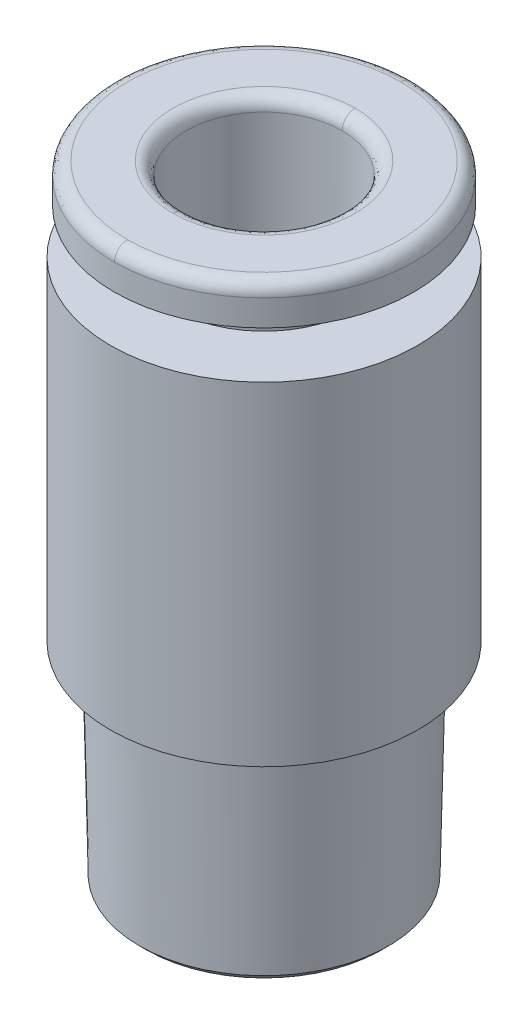
ISO-10303-21;
HEADER;
FILE_DESCRIPTION(('STEP AP214'),'2;1');
FILE_NAME('part.step','',(''),(''),'','','');
FILE_SCHEMA(('AUTOMOTIVE_DESIGN { 1 0 10303 214 1 1 1 1 }'));
ENDSEC;
DATA;
#1=APPLICATION_CONTEXT('core data for automotive mechanical design processes');
#2=APPLICATION_PROTOCOL_DEFINITION('international standard','automotive_design',2000,#1);
#3=PRODUCT_CONTEXT('',#1,'mechanical');
#4=PRODUCT('Part','Part','',(#3));
#5=PRODUCT_RELATED_PRODUCT_CATEGORY('part','',(#4));
#6=PRODUCT_DEFINITION_FORMATION('','',#4);
#7=PRODUCT_DEFINITION_CONTEXT('part definition',#1,'design');
#8=PRODUCT_DEFINITION('design','',#6,#7);
#9=PRODUCT_DEFINITION_SHAPE('','',#8);
#10=(LENGTH_UNIT() NAMED_UNIT(*) SI_UNIT(.MILLI.,.METRE.));
#11=(NAMED_UNIT(*) PLANE_ANGLE_UNIT() SI_UNIT($,.RADIAN.));
#12=(NAMED_UNIT(*) SI_UNIT($,.STERADIAN.) SOLID_ANGLE_UNIT());
#13=UNCERTAINTY_MEASURE_WITH_UNIT(LENGTH_MEASURE(1.E-05),#10,'distance_accuracy_value','');
#14=(GEOMETRIC_REPRESENTATION_CONTEXT(3) GLOBAL_UNCERTAINTY_ASSIGNED_CONTEXT((#13)) GLOBAL_UNIT_ASSIGNED_CONTEXT((#10,
#11,#12)) REPRESENTATION_CONTEXT('',''));
#15=CARTESIAN_POINT('',(0.,0.,0.));
#16=DIRECTION('',(0.,0.,1.));
#17=DIRECTION('',(1.,0.,0.));
#18=AXIS2_PLACEMENT_3D('',#15,#16,#17);
#19=CARTESIAN_POINT('',(-5.819,-1.5,5.819));
#20=DIRECTION('',(0.,-1.,0.));
#21=DIRECTION('',(0.,0.,-1.));
#22=AXIS2_PLACEMENT_3D('',#19,#20,#21);
#23=PLANE('',#22);
#24=CARTESIAN_POINT('',(0.,-1.5,0.));
#25=DIRECTION('',(0.,1.,0.));
#26=DIRECTION('',(0.,0.,1.));
#27=AXIS2_PLACEMENT_3D('',#24,#25,#26);
#28=CIRCLE('',#27,3.5);
#29=CARTESIAN_POINT('',(0.,-1.5,3.5));
#30=VERTEX_POINT('',#29);
#31=EDGE_CURVE('E256',#30,#30,#28,.T.);
#32=ORIENTED_EDGE('',*,*,#31,.T.);
#33=EDGE_LOOP('',(#32));
#34=FACE_BOUND('',#33,.T.);
#35=CARTESIAN_POINT('',(0.,-1.5,0.));
#36=DIRECTION('',(0.,1.,0.));
#37=DIRECTION('',(0.,0.,1.));
#38=AXIS2_PLACEMENT_3D('',#35,#36,#37);
#39=CIRCLE('',#38,5.75);
#40=CARTESIAN_POINT('',(0.,-1.5,5.75));
#41=VERTEX_POINT('',#40);
#42=EDGE_CURVE('E19',#41,#41,#39,.F.);
#43=ORIENTED_EDGE('',*,*,#42,.T.);
#44=EDGE_LOOP('',(#43));
#45=FACE_BOUND('',#44,.T.);
#46=ADVANCED_FACE('F15',(#34,#45),#23,.T.);
#47=CARTESIAN_POINT('',(0.,-1.5,0.));
#48=DIRECTION('',(0.,1.,0.));
#49=DIRECTION('',(0.,0.,1.));
#50=AXIS2_PLACEMENT_3D('',#47,#48,#49);
#51=CYLINDRICAL_SURFACE('',#50,5.75);
#52=ORIENTED_EDGE('',*,*,#42,.F.);
#53=EDGE_LOOP('',(#52));
#54=FACE_BOUND('',#53,.T.);
#55=CARTESIAN_POINT('',(0.,-0.499999999442258,0.));
#56=DIRECTION('',(0.,1.,0.));
#57=DIRECTION('',(-1.,0.,0.));
#58=AXIS2_PLACEMENT_3D('',#55,#56,#57);
#59=CIRCLE('',#58,5.75000000026619);
#60=CARTESIAN_POINT('',(-2.58156681732607E-10,-0.499999999581694,5.75000000019965));
#61=VERTEX_POINT('',#60);
#62=CARTESIAN_POINT('',(-5.89672356981577E-10,-0.499999999442258,-5.75000000019965));
#63=VERTEX_POINT('',#62);
#64=EDGE_CURVE('E248',#61,#63,#59,.T.);
#65=ORIENTED_EDGE('',*,*,#64,.F.);
#66=CARTESIAN_POINT('',(0.,-0.499999999442258,0.));
#67=DIRECTION('',(0.,1.,0.));
#68=DIRECTION('',(-1.,0.,0.));
#69=AXIS2_PLACEMENT_3D('',#66,#67,#68);
#70=CIRCLE('',#69,5.75000000026619);
#71=EDGE_CURVE('E259',#63,#61,#70,.T.);
#72=ORIENTED_EDGE('',*,*,#71,.F.);
#73=EDGE_LOOP('',(#65,#72));
#74=FACE_BOUND('',#73,.T.);
#75=ADVANCED_FACE('F384',(#54,#74),#51,.T.);
#76=CARTESIAN_POINT('',(0.,-3.2,0.));
#77=DIRECTION('',(0.,1.,0.));
#78=DIRECTION('',(0.,0.,1.));
#79=AXIS2_PLACEMENT_3D('',#76,#77,#78);
#80=CYLINDRICAL_SURFACE('',#79,3.5);
#81=ORIENTED_EDGE('',*,*,#31,.F.);
#82=EDGE_LOOP('',(#81));
#83=FACE_BOUND('',#82,.T.);
#84=CARTESIAN_POINT('',(0.,-3.2,0.));
#85=DIRECTION('',(0.,1.,0.));
#86=DIRECTION('',(0.,0.,1.));
#87=AXIS2_PLACEMENT_3D('',#84,#85,#86);
#88=CIRCLE('',#87,3.5);
#89=CARTESIAN_POINT('',(0.,-3.2,3.5));
#90=VERTEX_POINT('',#89);
#91=EDGE_CURVE('E374',#90,#90,#88,.F.);
#92=ORIENTED_EDGE('',*,*,#91,.F.);
#93=EDGE_LOOP('',(#92));
#94=FACE_BOUND('',#93,.T.);
#95=ADVANCED_FACE('F233',(#83,#94),#80,.T.);
#96=CARTESIAN_POINT('',(0.,-0.002497917,5.200083292));
#97=CARTESIAN_POINT('',(10.400166583,-0.002497917,5.200083292));
#98=CARTESIAN_POINT('',(10.400166583,-0.002497917,-5.200083292));
#99=CARTESIAN_POINT('',(0.,-0.002497917,-5.200083292));
#100=CARTESIAN_POINT('',(0.,0.031610211,5.540026883));
#101=CARTESIAN_POINT('',(11.080053765,0.031610211,5.540026883));
#102=CARTESIAN_POINT('',(11.080053765,0.031610211,-5.540026883));
#103=CARTESIAN_POINT('',(0.,0.031610211,-5.540026883));
#104=CARTESIAN_POINT('',(0.,-0.209973117,5.781610211));
#105=CARTESIAN_POINT('',(11.563220423,-0.209973117,5.781610211));
#106=CARTESIAN_POINT('',(11.563220423,-0.209973117,-5.781610211));
#107=CARTESIAN_POINT('',(0.,-0.209973117,-5.781610211));
#108=CARTESIAN_POINT('',(0.,-0.549916708,5.747502083));
#109=CARTESIAN_POINT('',(11.495004165,-0.549916708,5.747502083));
#110=CARTESIAN_POINT('',(11.495004165,-0.549916708,-5.747502083));
#111=CARTESIAN_POINT('',(0.,-0.549916708,-5.747502083));
#112=(BOUNDED_SURFACE() B_SPLINE_SURFACE(3,3,((#96,#97,#98,#99),(#100,#101,#102,#103),(#104,
#105,#106,#107),(#108,#109,#110,#111)),.UNSPECIFIED.,.F.,.F.,
.F.) B_SPLINE_SURFACE_WITH_KNOTS((4,4),(4,4),(0.,1.),(0.,1.),
.UNSPECIFIED.) GEOMETRIC_REPRESENTATION_ITEM() RATIONAL_B_SPLINE_SURFACE(((1.,0.333333333333333,
0.333333333333333,1.),(0.755320871117972,0.251773623705991,0.251773623705991,0.755320871117972),
(0.755320871117972,0.251773623705991,0.251773623705991,0.755320871117972),(1.,0.333333333333333,
0.333333333333333,1.))) REPRESENTATION_ITEM('') SURFACE());
#113=CARTESIAN_POINT('',(0.,2.66194585747539E-10,-5.25000000080507));
#114=CARTESIAN_POINT('',(10.5000000006278,2.66194590023467E-10,-5.25000000080507));
#115=CARTESIAN_POINT('',(10.5000000006278,2.66194590023467E-10,5.25000000080507));
#116=CARTESIAN_POINT('',(0.,2.66194585747539E-10,5.25000000080507));
#117=(BOUNDED_CURVE() B_SPLINE_CURVE(3,(#113,#114,#115,#116),.UNSPECIFIED.,.F.,
.F.) B_SPLINE_CURVE_WITH_KNOTS((4,4),(0.,1.),
.UNSPECIFIED.) CURVE() GEOMETRIC_REPRESENTATION_ITEM() RATIONAL_B_SPLINE_CURVE((0.956578301969997,
0.318859433989999,0.318859433989999,0.956578301969997)) REPRESENTATION_ITEM(''));
#118=CARTESIAN_POINT('',(0.,1.59716751686634E-10,5.24999999939198));
#119=VERTEX_POINT('',#118);
#120=CARTESIAN_POINT('',(0.,1.59716751686634E-10,-5.24999999939198));
#121=VERTEX_POINT('',#120);
#122=EDGE_CURVE('E376',#119,#121,#117,.F.);
#123=CARTESIAN_POINT('',(0.,-0.002497917,5.200083292));
#124=CARTESIAN_POINT('',(0.,0.031610211,5.540026883));
#125=CARTESIAN_POINT('',(0.,-0.209973117,5.781610211));
#126=CARTESIAN_POINT('',(0.,-0.549916708,5.747502083));
#127=(BOUNDED_CURVE() B_SPLINE_CURVE(3,(#123,#124,#125,#126),.UNSPECIFIED.,.F.,
.F.) B_SPLINE_CURVE_WITH_KNOTS((4,4),(0.,1.),
.UNSPECIFIED.) CURVE() GEOMETRIC_REPRESENTATION_ITEM() RATIONAL_B_SPLINE_CURVE((1.,
0.755320871117972,0.755320871117972,1.)) REPRESENTATION_ITEM(''));
#128=EDGE_CURVE('E208',#61,#119,#127,.F.);
#129=CARTESIAN_POINT('',(0.,-0.002497917,-5.200083292));
#130=CARTESIAN_POINT('',(0.,0.031610211,-5.540026883));
#131=CARTESIAN_POINT('',(0.,-0.209973117,-5.781610211));
#132=CARTESIAN_POINT('',(0.,-0.549916708,-5.747502083));
#133=(BOUNDED_CURVE() B_SPLINE_CURVE(3,(#129,#130,#131,#132),.UNSPECIFIED.,.F.,
.F.) B_SPLINE_CURVE_WITH_KNOTS((4,4),(0.,1.),
.UNSPECIFIED.) CURVE() GEOMETRIC_REPRESENTATION_ITEM() RATIONAL_B_SPLINE_CURVE((1.,
0.755320871117972,0.755320871117972,1.)) REPRESENTATION_ITEM(''));
#134=EDGE_CURVE('E255',#121,#63,#133,.T.);
#135=ORIENTED_EDGE('',*,*,#122,.F.);
#136=ORIENTED_EDGE('',*,*,#128,.F.);
#137=ORIENTED_EDGE('',*,*,#64,.T.);
#138=ORIENTED_EDGE('',*,*,#134,.F.);
#139=EDGE_LOOP('',(#135,#136,#137,#138));
#140=FACE_BOUND('',#139,.T.);
#141=ADVANCED_FACE('F222',(#140),#112,.T.);
#142=CARTESIAN_POINT('',(0.,-0.002497917,-5.200083292));
#143=CARTESIAN_POINT('',(-10.400166583,-0.002497917,-5.200083292));
#144=CARTESIAN_POINT('',(-10.400166583,-0.002497917,5.200083292));
#145=CARTESIAN_POINT('',(0.,-0.002497917,5.200083292));
#146=CARTESIAN_POINT('',(0.,0.031610211,-5.540026883));
#147=CARTESIAN_POINT('',(-11.080053765,0.031610211,-5.540026883));
#148=CARTESIAN_POINT('',(-11.080053765,0.031610211,5.540026883));
#149=CARTESIAN_POINT('',(0.,0.031610211,5.540026883));
#150=CARTESIAN_POINT('',(0.,-0.209973117,-5.781610211));
#151=CARTESIAN_POINT('',(-11.563220423,-0.209973117,-5.781610211));
#152=CARTESIAN_POINT('',(-11.563220423,-0.209973117,5.781610211));
#153=CARTESIAN_POINT('',(0.,-0.209973117,5.781610211));
#154=CARTESIAN_POINT('',(0.,-0.549916708,-5.747502083));
#155=CARTESIAN_POINT('',(-11.495004165,-0.549916708,-5.747502083));
#156=CARTESIAN_POINT('',(-11.495004165,-0.549916708,5.747502083));
#157=CARTESIAN_POINT('',(0.,-0.549916708,5.747502083));
#158=(BOUNDED_SURFACE() B_SPLINE_SURFACE(3,3,((#142,#143,#144,#145),(#146,#147,#148,#149),(#150,
#151,#152,#153),(#154,#155,#156,#157)),.UNSPECIFIED.,.F.,.F.,
.F.) B_SPLINE_SURFACE_WITH_KNOTS((4,4),(4,4),(0.,1.),(0.,1.),
.UNSPECIFIED.) GEOMETRIC_REPRESENTATION_ITEM() RATIONAL_B_SPLINE_SURFACE(((1.,0.333333333333333,
0.333333333333333,1.),(0.755320871117972,0.251773623705991,0.251773623705991,0.755320871117972),
(0.755320871117972,0.251773623705991,0.251773623705991,0.755320871117972),(1.,0.333333333333333,
0.333333333333333,1.))) REPRESENTATION_ITEM('') SURFACE());
#159=CARTESIAN_POINT('',(0.,2.6619458558077E-10,5.25000000080507));
#160=CARTESIAN_POINT('',(-10.5000000006278,2.6619458974894E-10,5.25000000080507));
#161=CARTESIAN_POINT('',(-10.5000000006278,2.6619458974894E-10,-5.25000000080507));
#162=CARTESIAN_POINT('',(0.,2.6619458558077E-10,-5.25000000080507));
#163=(BOUNDED_CURVE() B_SPLINE_CURVE(3,(#159,#160,#161,#162),.UNSPECIFIED.,.F.,
.F.) B_SPLINE_CURVE_WITH_KNOTS((4,4),(0.,1.),
.UNSPECIFIED.) CURVE() GEOMETRIC_REPRESENTATION_ITEM() RATIONAL_B_SPLINE_CURVE((0.956578301969996,
0.318859433989999,0.318859433989999,0.956578301969996)) REPRESENTATION_ITEM(''));
#164=EDGE_CURVE('E204',#121,#119,#163,.F.);
#165=ORIENTED_EDGE('',*,*,#128,.T.);
#166=ORIENTED_EDGE('',*,*,#164,.F.);
#167=ORIENTED_EDGE('',*,*,#134,.T.);
#168=ORIENTED_EDGE('',*,*,#71,.T.);
#169=EDGE_LOOP('',(#165,#166,#167,#168));
#170=FACE_BOUND('',#169,.T.);
#171=ADVANCED_FACE('F210',(#170),#158,.T.);
#172=CARTESIAN_POINT('',(-5.9708,-3.2,-5.9708));
#173=DIRECTION('',(0.,1.,0.));
#174=DIRECTION('',(0.,0.,1.));
#175=AXIS2_PLACEMENT_3D('',#172,#173,#174);
#176=PLANE('',#175);
#177=ORIENTED_EDGE('',*,*,#91,.T.);
#178=EDGE_LOOP('',(#177));
#179=FACE_BOUND('',#178,.T.);
#180=CARTESIAN_POINT('',(0.,-3.2,0.));
#181=DIRECTION('',(0.,1.,0.));
#182=DIRECTION('',(0.,0.,1.));
#183=AXIS2_PLACEMENT_3D('',#180,#181,#182);
#184=CIRCLE('',#183,5.9);
#185=CARTESIAN_POINT('',(0.,-3.2,5.9));
#186=VERTEX_POINT('',#185);
#187=EDGE_CURVE('E371',#186,#186,#184,.T.);
#188=ORIENTED_EDGE('',*,*,#187,.T.);
#189=EDGE_LOOP('',(#188));
#190=FACE_BOUND('',#189,.T.);
#191=ADVANCED_FACE('F221',(#179,#190),#176,.T.);
#192=CARTESIAN_POINT('',(-5.313,0.,-5.313));
#193=DIRECTION('',(0.,1.,0.));
#194=DIRECTION('',(0.,0.,1.));
#195=AXIS2_PLACEMENT_3D('',#192,#193,#194);
#196=PLANE('',#195);
#197=CARTESIAN_POINT('',(0.,2.66194585363917E-10,-3.49999999919493));
#198=CARTESIAN_POINT('',(-6.99999999937216,2.66194589507712E-10,-3.49999999919493));
#199=CARTESIAN_POINT('',(-6.99999999937216,2.66194589507712E-10,3.49999999919493));
#200=CARTESIAN_POINT('',(0.,2.66194585363917E-10,3.49999999919493));
#201=(BOUNDED_CURVE() B_SPLINE_CURVE(3,(#197,#198,#199,#200),.UNSPECIFIED.,.F.,
.F.) B_SPLINE_CURVE_WITH_KNOTS((4,4),(0.,1.),
.UNSPECIFIED.) CURVE() GEOMETRIC_REPRESENTATION_ITEM() RATIONAL_B_SPLINE_CURVE((0.956578301969995,
0.318859433989998,0.318859433989998,0.956578301969995)) REPRESENTATION_ITEM(''));
#202=CARTESIAN_POINT('',(0.,1.59716751337877E-10,-3.49999999887202));
#203=VERTEX_POINT('',#202);
#204=CARTESIAN_POINT('',(0.,1.59716751337877E-10,3.49999999887202));
#205=VERTEX_POINT('',#204);
#206=EDGE_CURVE('E130',#203,#205,#201,.T.);
#207=ORIENTED_EDGE('',*,*,#206,.F.);
#208=CARTESIAN_POINT('',(0.,2.66194585682711E-10,3.49999999919493));
#209=CARTESIAN_POINT('',(6.99999999937216,2.66194590114184E-10,3.49999999919493));
#210=CARTESIAN_POINT('',(6.99999999937216,2.66194590114184E-10,-3.49999999919493));
#211=CARTESIAN_POINT('',(0.,2.66194585682711E-10,-3.49999999919493));
#212=(BOUNDED_CURVE() B_SPLINE_CURVE(3,(#208,#209,#210,#211),.UNSPECIFIED.,.F.,
.F.) B_SPLINE_CURVE_WITH_KNOTS((4,4),(0.,1.),
.UNSPECIFIED.) CURVE() GEOMETRIC_REPRESENTATION_ITEM() RATIONAL_B_SPLINE_CURVE((0.956578301969996,
0.318859433989998,0.318859433989998,0.956578301969996)) REPRESENTATION_ITEM(''));
#213=EDGE_CURVE('E148',#205,#203,#212,.T.);
#214=ORIENTED_EDGE('',*,*,#213,.F.);
#215=EDGE_LOOP('',(#207,#214));
#216=FACE_BOUND('',#215,.T.);
#217=ORIENTED_EDGE('',*,*,#122,.T.);
#218=ORIENTED_EDGE('',*,*,#164,.T.);
#219=EDGE_LOOP('',(#217,#218));
#220=FACE_BOUND('',#219,.T.);
#221=ADVANCED_FACE('F270',(#216,#220),#196,.T.);
#222=CARTESIAN_POINT('',(0.,-16.,0.));
#223=DIRECTION('',(0.,1.,0.));
#224=DIRECTION('',(0.,0.,1.));
#225=AXIS2_PLACEMENT_3D('',#222,#223,#224);
#226=CYLINDRICAL_SURFACE('',#225,5.9);
#227=CARTESIAN_POINT('',(0.,-16.,0.));
#228=DIRECTION('',(0.,1.,0.));
#229=DIRECTION('',(0.,0.,1.));
#230=AXIS2_PLACEMENT_3D('',#227,#228,#229);
#231=CIRCLE('',#230,5.9);
#232=CARTESIAN_POINT('',(0.,-16.,5.9));
#233=VERTEX_POINT('',#232);
#234=EDGE_CURVE('E124',#233,#233,#231,.T.);
#235=ORIENTED_EDGE('',*,*,#234,.T.);
#236=EDGE_LOOP('',(#235));
#237=FACE_BOUND('',#236,.T.);
#238=ORIENTED_EDGE('',*,*,#187,.F.);
#239=EDGE_LOOP('',(#238));
#240=FACE_BOUND('',#239,.T.);
#241=ADVANCED_FACE('F184',(#237,#240),#226,.T.);
#242=CARTESIAN_POINT('',(0.,-0.549916708,-3.002497917));
#243=CARTESIAN_POINT('',(-6.004995835,-0.549916708,-3.002497917));
#244=CARTESIAN_POINT('',(-6.004995835,-0.549916708,3.002497917));
#245=CARTESIAN_POINT('',(0.,-0.549916708,3.002497917));
#246=CARTESIAN_POINT('',(0.,-0.209973117,-2.968389789));
#247=CARTESIAN_POINT('',(-5.936779577,-0.209973117,-2.968389789));
#248=CARTESIAN_POINT('',(-5.936779577,-0.209973117,2.968389789));
#249=CARTESIAN_POINT('',(0.,-0.209973117,2.968389789));
#250=CARTESIAN_POINT('',(0.,0.031610211,-3.209973117));
#251=CARTESIAN_POINT('',(-6.419946235,0.031610211,-3.209973117));
#252=CARTESIAN_POINT('',(-6.419946235,0.031610211,3.209973117));
#253=CARTESIAN_POINT('',(0.,0.031610211,3.209973117));
#254=CARTESIAN_POINT('',(0.,-0.002497917,-3.549916708));
#255=CARTESIAN_POINT('',(-7.099833417,-0.002497917,-3.549916708));
#256=CARTESIAN_POINT('',(-7.099833417,-0.002497917,3.549916708));
#257=CARTESIAN_POINT('',(0.,-0.002497917,3.549916708));
#258=(BOUNDED_SURFACE() B_SPLINE_SURFACE(3,3,((#242,#243,#244,#245),(#246,#247,#248,#249),(#250,
#251,#252,#253),(#254,#255,#256,#257)),.UNSPECIFIED.,.F.,.F.,
.F.) B_SPLINE_SURFACE_WITH_KNOTS((4,4),(4,4),(0.,1.),(0.,1.),
.UNSPECIFIED.) GEOMETRIC_REPRESENTATION_ITEM() RATIONAL_B_SPLINE_SURFACE(((1.,0.333333333333333,
0.333333333333333,1.),(0.755320871117972,0.251773623705991,0.251773623705991,0.755320871117972),
(0.755320871117972,0.251773623705991,0.251773623705991,0.755320871117972),(1.,0.333333333333333,
0.333333333333333,1.))) REPRESENTATION_ITEM('') SURFACE());
#259=CARTESIAN_POINT('',(0.,-0.549916708,3.002497917));
#260=CARTESIAN_POINT('',(0.,-0.209973117,2.968389789));
#261=CARTESIAN_POINT('',(0.,0.031610211,3.209973117));
#262=CARTESIAN_POINT('',(0.,-0.002497917,3.549916708));
#263=(BOUNDED_CURVE() B_SPLINE_CURVE(3,(#259,#260,#261,#262),.UNSPECIFIED.,.F.,
.F.) B_SPLINE_CURVE_WITH_KNOTS((4,4),(0.,1.),
.UNSPECIFIED.) CURVE() GEOMETRIC_REPRESENTATION_ITEM() RATIONAL_B_SPLINE_CURVE((1.,
0.755320871117972,0.755320871117972,1.)) REPRESENTATION_ITEM(''));
#264=CARTESIAN_POINT('',(0.,-0.5,2.99999999993345));
#265=VERTEX_POINT('',#264);
#266=EDGE_CURVE('E127',#265,#205,#263,.T.);
#267=CARTESIAN_POINT('',(0.,-0.5,0.));
#268=DIRECTION('',(0.,1.,0.));
#269=DIRECTION('',(0.,0.,1.));
#270=AXIS2_PLACEMENT_3D('',#267,#268,#269);
#271=CIRCLE('',#270,3.);
#272=CARTESIAN_POINT('',(-7.69137856939317E-10,-0.5,-2.99999999993345));
#273=VERTEX_POINT('',#272);
#274=EDGE_CURVE('E117',#273,#265,#271,.T.);
#275=CARTESIAN_POINT('',(0.,-0.549916708,-3.002497917));
#276=CARTESIAN_POINT('',(0.,-0.209973117,-2.968389789));
#277=CARTESIAN_POINT('',(0.,0.031610211,-3.209973117));
#278=CARTESIAN_POINT('',(0.,-0.002497917,-3.549916708));
#279=(BOUNDED_CURVE() B_SPLINE_CURVE(3,(#275,#276,#277,#278),.UNSPECIFIED.,.F.,
.F.) B_SPLINE_CURVE_WITH_KNOTS((4,4),(0.,1.),
.UNSPECIFIED.) CURVE() GEOMETRIC_REPRESENTATION_ITEM() RATIONAL_B_SPLINE_CURVE((1.,
0.755320871117972,0.755320871117972,1.)) REPRESENTATION_ITEM(''));
#280=EDGE_CURVE('E134',#203,#273,#279,.F.);
#281=ORIENTED_EDGE('',*,*,#266,.F.);
#282=ORIENTED_EDGE('',*,*,#274,.F.);
#283=ORIENTED_EDGE('',*,*,#280,.F.);
#284=ORIENTED_EDGE('',*,*,#206,.T.);
#285=EDGE_LOOP('',(#281,#282,#283,#284));
#286=FACE_BOUND('',#285,.T.);
#287=ADVANCED_FACE('F128',(#286),#258,.T.);
#288=CARTESIAN_POINT('',(0.,-0.549916708,3.002497917));
#289=CARTESIAN_POINT('',(6.004995835,-0.549916708,3.002497917));
#290=CARTESIAN_POINT('',(6.004995835,-0.549916708,-3.002497917));
#291=CARTESIAN_POINT('',(0.,-0.549916708,-3.002497917));
#292=CARTESIAN_POINT('',(0.,-0.209973117,2.968389789));
#293=CARTESIAN_POINT('',(5.936779577,-0.209973117,2.968389789));
#294=CARTESIAN_POINT('',(5.936779577,-0.209973117,-2.968389789));
#295=CARTESIAN_POINT('',(0.,-0.209973117,-2.968389789));
#296=CARTESIAN_POINT('',(0.,0.031610211,3.209973117));
#297=CARTESIAN_POINT('',(6.419946235,0.031610211,3.209973117));
#298=CARTESIAN_POINT('',(6.419946235,0.031610211,-3.209973117));
#299=CARTESIAN_POINT('',(0.,0.031610211,-3.209973117));
#300=CARTESIAN_POINT('',(0.,-0.002497917,3.549916708));
#301=CARTESIAN_POINT('',(7.099833417,-0.002497917,3.549916708));
#302=CARTESIAN_POINT('',(7.099833417,-0.002497917,-3.549916708));
#303=CARTESIAN_POINT('',(0.,-0.002497917,-3.549916708));
#304=(BOUNDED_SURFACE() B_SPLINE_SURFACE(3,3,((#288,#289,#290,#291),(#292,#293,#294,#295),(#296,
#297,#298,#299),(#300,#301,#302,#303)),.UNSPECIFIED.,.F.,.F.,
.F.) B_SPLINE_SURFACE_WITH_KNOTS((4,4),(4,4),(0.,1.),(0.,1.),
.UNSPECIFIED.) GEOMETRIC_REPRESENTATION_ITEM() RATIONAL_B_SPLINE_SURFACE(((1.,0.333333333333333,
0.333333333333333,1.),(0.755320871117972,0.251773623705991,0.251773623705991,0.755320871117972),
(0.755320871117972,0.251773623705991,0.251773623705991,0.755320871117972),(1.,0.333333333333333,
0.333333333333333,1.))) REPRESENTATION_ITEM('') SURFACE());
#305=CARTESIAN_POINT('',(0.,-0.5,0.));
#306=DIRECTION('',(0.,1.,0.));
#307=DIRECTION('',(0.,0.,1.));
#308=AXIS2_PLACEMENT_3D('',#305,#306,#307);
#309=CIRCLE('',#308,3.);
#310=EDGE_CURVE('E121',#265,#273,#309,.T.);
#311=ORIENTED_EDGE('',*,*,#310,.F.);
#312=ORIENTED_EDGE('',*,*,#266,.T.);
#313=ORIENTED_EDGE('',*,*,#213,.T.);
#314=ORIENTED_EDGE('',*,*,#280,.T.);
#315=EDGE_LOOP('',(#311,#312,#313,#314));
#316=FACE_BOUND('',#315,.T.);
#317=ADVANCED_FACE('F136',(#316),#304,.T.);
#318=CARTESIAN_POINT('',(-5.9708,-16.,-5.9708));
#319=DIRECTION('',(0.,1.,0.));
#320=DIRECTION('',(0.,0.,1.));
#321=AXIS2_PLACEMENT_3D('',#318,#319,#320);
#322=PLANE('',#321);
#323=CARTESIAN_POINT('',(0.,-16.,0.));
#324=DIRECTION('',(0.,1.,0.));
#325=DIRECTION('',(-1.,0.,0.));
#326=AXIS2_PLACEMENT_3D('',#323,#324,#325);
#327=CIRCLE('',#326,4.951231213);
#328=CARTESIAN_POINT('',(-4.951231213,-16.,0.));
#329=VERTEX_POINT('',#328);
#330=EDGE_CURVE('E359',#329,#329,#327,.T.);
#331=ORIENTED_EDGE('',*,*,#330,.T.);
#332=EDGE_LOOP('',(#331));
#333=FACE_BOUND('',#332,.T.);
#334=ORIENTED_EDGE('',*,*,#234,.F.);
#335=EDGE_LOOP('',(#334));
#336=FACE_BOUND('',#335,.T.);
#337=ADVANCED_FACE('F172',(#333,#336),#322,.F.);
#338=CARTESIAN_POINT('',(0.,-17.,0.));
#339=DIRECTION('',(0.,1.,0.));
#340=DIRECTION('',(0.,0.,1.));
#341=AXIS2_PLACEMENT_3D('',#338,#339,#340);
#342=CYLINDRICAL_SURFACE('',#341,3.);
#343=CARTESIAN_POINT('',(0.,-17.,0.));
#344=DIRECTION('',(0.,1.,0.));
#345=DIRECTION('',(0.,0.,1.));
#346=AXIS2_PLACEMENT_3D('',#343,#344,#345);
#347=CIRCLE('',#346,3.);
#348=CARTESIAN_POINT('',(0.,-17.,3.));
#349=VERTEX_POINT('',#348);
#350=EDGE_CURVE('E349',#349,#349,#347,.T.);
#351=ORIENTED_EDGE('',*,*,#350,.F.);
#352=EDGE_LOOP('',(#351));
#353=FACE_BOUND('',#352,.T.);
#354=ORIENTED_EDGE('',*,*,#310,.T.);
#355=ORIENTED_EDGE('',*,*,#274,.T.);
#356=EDGE_LOOP('',(#354,#355));
#357=FACE_BOUND('',#356,.T.);
#358=ADVANCED_FACE('F119',(#353,#357),#342,.F.);
#359=CARTESIAN_POINT('',(-1.094215991,-19.,-1.965079231));
#360=DIRECTION('',(-0.865497844395057,-0.0348994965801741,-0.499695413713155));
#361=DIRECTION('',(-0.500000000201594,0.,0.866025403668048));
#362=AXIS2_PLACEMENT_3D('',#359,#360,#361);
#363=PLANE('',#362);
#364=DIRECTION('',(0.0402902894215199,-0.999188016630669,2.50101325234303E-10));
#365=VECTOR('',#364,1.);
#366=CARTESIAN_POINT('',(-2.309401077,-17.,0.));
#367=LINE('',#366,#365);
#368=CARTESIAN_POINT('',(-2.30940107804008,-16.9999999999886,-1.63479430516348E-10));
#369=VERTEX_POINT('',#368);
#370=CARTESIAN_POINT('',(-2.22875501475122,-19.,2.50304263424666E-10));
#371=VERTEX_POINT('',#370);
#372=EDGE_CURVE('E355',#369,#371,#367,.T.);
#373=ORIENTED_EDGE('',*,*,#372,.T.);
#374=DIRECTION('',(-0.500000000201594,0.,0.866025403668048));
#375=VECTOR('',#374,1.);
#376=CARTESIAN_POINT('',(-1.6715662605,-19.,-0.965079231));
#377=LINE('',#376,#375);
#378=CARTESIAN_POINT('',(-1.67156626063081,-19.,-0.965079230571469));
#379=VERTEX_POINT('',#378);
#380=EDGE_CURVE('E138',#379,#371,#377,.T.);
#381=ORIENTED_EDGE('',*,*,#380,.F.);
#382=DIRECTION('',(-0.500000000201594,0.,0.866025403668048));
#383=VECTOR('',#382,1.);
#384=CARTESIAN_POINT('',(-1.6715662605,-19.,-0.965079231));
#385=LINE('',#384,#383);
#386=CARTESIAN_POINT('',(-1.11437750686089,-19.,-1.93015846119011));
#387=VERTEX_POINT('',#386);
#388=EDGE_CURVE('E78',#387,#379,#385,.T.);
#389=ORIENTED_EDGE('',*,*,#388,.F.);
#390=DIRECTION('',(-0.0201451448089672,0.99918801662656,-0.0348924142258206));
#391=VECTOR('',#390,1.);
#392=CARTESIAN_POINT('',(-1.11437750675059,-19.0000000000265,-1.9301584613793));
#393=LINE('',#392,#391);
#394=CARTESIAN_POINT('',(-1.15470053875616,-16.9999999999948,-1.99999999957824));
#395=VERTEX_POINT('',#394);
#396=EDGE_CURVE('E366',#387,#395,#393,.T.);
#397=ORIENTED_EDGE('',*,*,#396,.T.);
#398=DIRECTION('',(0.500000000470733,0.,-0.866025403512661));
#399=VECTOR('',#398,1.);
#400=CARTESIAN_POINT('',(-2.309401078512,-17.,0.));
#401=LINE('',#400,#399);
#402=EDGE_CURVE('E309',#369,#395,#401,.T.);
#403=ORIENTED_EDGE('',*,*,#402,.F.);
#404=EDGE_LOOP('',(#373,#381,#389,#397,#403));
#405=FACE_BOUND('',#404,.T.);
#406=ADVANCED_FACE('F496',(#405),#363,.F.);
#407=CARTESIAN_POINT('',(-1.154700538,-19.,-1.930158461));
#408=DIRECTION('',(0.,-0.0348994967107381,-0.999390827018808));
#409=DIRECTION('',(0.,0.999390827018808,-0.0348994967107381));
#410=AXIS2_PLACEMENT_3D('',#407,#408,#409);
#411=PLANE('',#410);
#412=ORIENTED_EDGE('',*,*,#396,.F.);
#413=DIRECTION('',(-1.,0.,0.));
#414=VECTOR('',#413,1.);
#415=CARTESIAN_POINT('',(0.,-19.,-1.930158461));
#416=LINE('',#415,#414);
#417=CARTESIAN_POINT('',(-3.95882117928975E-10,-19.,-1.930158461));
#418=VERTEX_POINT('',#417);
#419=EDGE_CURVE('E85',#418,#387,#416,.T.);
#420=ORIENTED_EDGE('',*,*,#419,.F.);
#421=DIRECTION('',(-1.,0.,0.));
#422=VECTOR('',#421,1.);
#423=CARTESIAN_POINT('',(0.,-19.,-1.930158461));
#424=LINE('',#423,#422);
#425=CARTESIAN_POINT('',(1.11437750697065,-19.,-1.930158461));
#426=VERTEX_POINT('',#425);
#427=EDGE_CURVE('E460',#426,#418,#424,.T.);
#428=ORIENTED_EDGE('',*,*,#427,.F.);
#429=DIRECTION('',(0.0201451446992059,0.999188016622145,-0.034892414415624));
#430=VECTOR('',#429,1.);
#431=CARTESIAN_POINT('',(1.11437750697065,-19.,-1.930158461));
#432=LINE('',#431,#430);
#433=CARTESIAN_POINT('',(1.15470053875616,-16.9999999999948,-1.99999999957824));
#434=VERTEX_POINT('',#433);
#435=EDGE_CURVE('E362',#426,#434,#432,.T.);
#436=ORIENTED_EDGE('',*,*,#435,.T.);
#437=DIRECTION('',(1.,0.,0.));
#438=VECTOR('',#437,1.);
#439=CARTESIAN_POINT('',(0.,-17.,-1.999999999008));
#440=LINE('',#439,#438);
#441=EDGE_CURVE('E302',#395,#434,#440,.T.);
#442=ORIENTED_EDGE('',*,*,#441,.F.);
#443=EDGE_LOOP('',(#412,#420,#428,#436,#442));
#444=FACE_BOUND('',#443,.T.);
#445=ADVANCED_FACE('F440',(#444),#411,.F.);
#446=CARTESIAN_POINT('',(2.24891653,-19.,0.034920769));
#447=DIRECTION('',(0.865497844395057,-0.034899496580174,-0.499695413713155));
#448=DIRECTION('',(-0.500000000201594,0.,-0.866025403668048));
#449=AXIS2_PLACEMENT_3D('',#446,#447,#448);
#450=PLANE('',#449);
#451=ORIENTED_EDGE('',*,*,#435,.F.);
#452=DIRECTION('',(-0.500000000201594,0.,-0.866025403668048));
#453=VECTOR('',#452,1.);
#454=CARTESIAN_POINT('',(1.6715662605,-19.,-0.965079231));
#455=LINE('',#454,#453);
#456=CARTESIAN_POINT('',(1.67156626071747,-19.,-0.965079230421374));
#457=VERTEX_POINT('',#456);
#458=EDGE_CURVE('E365',#457,#426,#455,.T.);
#459=ORIENTED_EDGE('',*,*,#458,.F.);
#460=DIRECTION('',(-0.500000000201594,0.,-0.866025403668048));
#461=VECTOR('',#460,1.);
#462=CARTESIAN_POINT('',(1.6715662605,-19.,-0.965079231));
#463=LINE('',#462,#461);
#464=CARTESIAN_POINT('',(2.22875501475122,-19.,2.50304485252577E-10));
#465=VERTEX_POINT('',#464);
#466=EDGE_CURVE('E368',#465,#457,#463,.T.);
#467=ORIENTED_EDGE('',*,*,#466,.F.);
#468=DIRECTION('',(0.0402902894215198,0.999188016630669,-2.50101284420446E-10));
#469=VECTOR('',#468,1.);
#470=CARTESIAN_POINT('',(2.22875501489432,-19.0000000000349,5.00609055076873E-10));
#471=LINE('',#470,#469);
#472=CARTESIAN_POINT('',(2.30940107804008,-16.9999999999886,1.63479290682911E-10));
#473=VERTEX_POINT('',#472);
#474=EDGE_CURVE('E352',#465,#473,#471,.T.);
#475=ORIENTED_EDGE('',*,*,#474,.T.);
#476=DIRECTION('',(0.500000000470732,0.,0.866025403512661));
#477=VECTOR('',#476,1.);
#478=CARTESIAN_POINT('',(1.154700539256,-17.,-1.999999999008));
#479=LINE('',#478,#477);
#480=EDGE_CURVE('E308',#434,#473,#479,.T.);
#481=ORIENTED_EDGE('',*,*,#480,.F.);
#482=EDGE_LOOP('',(#451,#459,#467,#475,#481));
#483=FACE_BOUND('',#482,.T.);
#484=ADVANCED_FACE('F430',(#483),#450,.F.);
#485=CARTESIAN_POINT('',(0.,-23.744468911,0.));
#486=DIRECTION('',(0.,1.,0.));
#487=DIRECTION('',(-1.,0.,0.));
#488=AXIS2_PLACEMENT_3D('',#485,#486,#487);
#489=CONICAL_SURFACE('',#488,4.783598603,0.0216420827822266);
#490=ORIENTED_EDGE('',*,*,#330,.F.);
#491=EDGE_LOOP('',(#490));
#492=FACE_BOUND('',#491,.T.);
#493=CARTESIAN_POINT('',(0.,-23.744468911,0.));
#494=DIRECTION('',(0.,1.,0.));
#495=DIRECTION('',(0.,0.,1.));
#496=AXIS2_PLACEMENT_3D('',#493,#494,#495);
#497=CIRCLE('',#496,4.783598603);
#498=CARTESIAN_POINT('',(0.,-23.744468911,4.783598603));
#499=VERTEX_POINT('',#498);
#500=EDGE_CURVE('E339',#499,#499,#497,.T.);
#501=ORIENTED_EDGE('',*,*,#500,.T.);
#502=EDGE_LOOP('',(#501));
#503=FACE_BOUND('',#502,.T.);
#504=ADVANCED_FACE('F427',(#492,#503),#489,.T.);
#505=CARTESIAN_POINT('',(-2.24891653,-19.,-0.034920769));
#506=DIRECTION('',(-0.865497844395057,-0.034899496580174,0.499695413713155));
#507=DIRECTION('',(0.500000000201594,0.,0.866025403668048));
#508=AXIS2_PLACEMENT_3D('',#505,#506,#507);
#509=PLANE('',#508);
#510=DIRECTION('',(0.0201451448089671,-0.99918801662656,-0.0348924142258206));
#511=VECTOR('',#510,1.);
#512=CARTESIAN_POINT('',(-1.154700538,-17.,2.));
#513=LINE('',#512,#511);
#514=CARTESIAN_POINT('',(-1.15470053834163,-17.,2.));
#515=VERTEX_POINT('',#514);
#516=CARTESIAN_POINT('',(-1.11437750686089,-19.,1.93015846119011));
#517=VERTEX_POINT('',#516);
#518=EDGE_CURVE('E336',#515,#517,#513,.T.);
#519=ORIENTED_EDGE('',*,*,#518,.T.);
#520=DIRECTION('',(0.500000000201594,0.,0.866025403668048));
#521=VECTOR('',#520,1.);
#522=CARTESIAN_POINT('',(-1.6715662605,-19.,0.965079231));
#523=LINE('',#522,#521);
#524=CARTESIAN_POINT('',(-1.67156626051953,-19.,0.965079230764217));
#525=VERTEX_POINT('',#524);
#526=EDGE_CURVE('E450',#525,#517,#523,.T.);
#527=ORIENTED_EDGE('',*,*,#526,.F.);
#528=DIRECTION('',(0.500000000201594,0.,0.866025403668048));
#529=VECTOR('',#528,1.);
#530=CARTESIAN_POINT('',(-1.6715662605,-19.,0.965079231));
#531=LINE('',#530,#529);
#532=EDGE_CURVE('E358',#371,#525,#531,.T.);
#533=ORIENTED_EDGE('',*,*,#532,.F.);
#534=ORIENTED_EDGE('',*,*,#372,.F.);
#535=DIRECTION('',(-0.500000000470733,0.,-0.866025403512661));
#536=VECTOR('',#535,1.);
#537=CARTESIAN_POINT('',(-1.154700539256,-17.,1.999999999008));
#538=LINE('',#537,#536);
#539=EDGE_CURVE('E344',#515,#369,#538,.T.);
#540=ORIENTED_EDGE('',*,*,#539,.F.);
#541=EDGE_LOOP('',(#519,#527,#533,#534,#540));
#542=FACE_BOUND('',#541,.T.);
#543=ADVANCED_FACE('F429',(#542),#509,.F.);
#544=CARTESIAN_POINT('',(1.094215991,-19.,1.965079231));
#545=DIRECTION('',(0.865497844395057,-0.0348994965801741,0.499695413713155));
#546=DIRECTION('',(0.500000000201594,0.,-0.866025403668048));
#547=AXIS2_PLACEMENT_3D('',#544,#545,#546);
#548=PLANE('',#547);
#549=ORIENTED_EDGE('',*,*,#474,.F.);
#550=DIRECTION('',(0.500000000201594,0.,-0.866025403668048));
#551=VECTOR('',#550,1.);
#552=CARTESIAN_POINT('',(1.6715662605,-19.,0.965079231));
#553=LINE('',#552,#551);
#554=CARTESIAN_POINT('',(1.67156626043287,-19.,0.965079230914313));
#555=VERTEX_POINT('',#554);
#556=EDGE_CURVE('E354',#555,#465,#553,.T.);
#557=ORIENTED_EDGE('',*,*,#556,.F.);
#558=DIRECTION('',(0.500000000201594,0.,-0.866025403668048));
#559=VECTOR('',#558,1.);
#560=CARTESIAN_POINT('',(1.6715662605,-19.,0.965079231));
#561=LINE('',#560,#559);
#562=CARTESIAN_POINT('',(1.11437750686089,-19.,1.93015846119011));
#563=VERTEX_POINT('',#562);
#564=EDGE_CURVE('E456',#563,#555,#561,.T.);
#565=ORIENTED_EDGE('',*,*,#564,.F.);
#566=DIRECTION('',(0.0201451448089672,0.99918801662656,0.0348924142258205));
#567=VECTOR('',#566,1.);
#568=CARTESIAN_POINT('',(1.11437750675059,-19.0000000000265,1.9301584613793));
#569=LINE('',#568,#567);
#570=CARTESIAN_POINT('',(1.15470053834163,-17.,2.));
#571=VERTEX_POINT('',#570);
#572=EDGE_CURVE('E332',#563,#571,#569,.T.);
#573=ORIENTED_EDGE('',*,*,#572,.T.);
#574=DIRECTION('',(-0.500000000470732,0.,0.866025403512661));
#575=VECTOR('',#574,1.);
#576=CARTESIAN_POINT('',(2.309401078512,-17.,0.));
#577=LINE('',#576,#575);
#578=EDGE_CURVE('E347',#473,#571,#577,.T.);
#579=ORIENTED_EDGE('',*,*,#578,.F.);
#580=EDGE_LOOP('',(#549,#557,#565,#573,#579));
#581=FACE_BOUND('',#580,.T.);
#582=ADVANCED_FACE('F436',(#581),#548,.F.);
#583=CARTESIAN_POINT('',(-3.036,-17.,-3.036));
#584=DIRECTION('',(0.,1.,0.));
#585=DIRECTION('',(0.,0.,1.));
#586=AXIS2_PLACEMENT_3D('',#583,#584,#585);
#587=PLANE('',#586);
#588=ORIENTED_EDGE('',*,*,#441,.T.);
#589=ORIENTED_EDGE('',*,*,#480,.T.);
#590=ORIENTED_EDGE('',*,*,#578,.T.);
#591=DIRECTION('',(-1.,0.,0.));
#592=VECTOR('',#591,1.);
#593=CARTESIAN_POINT('',(0.,-17.,2.));
#594=LINE('',#593,#592);
#595=EDGE_CURVE('E335',#571,#515,#594,.T.);
#596=ORIENTED_EDGE('',*,*,#595,.T.);
#597=ORIENTED_EDGE('',*,*,#539,.T.);
#598=ORIENTED_EDGE('',*,*,#402,.T.);
#599=EDGE_LOOP('',(#588,#589,#590,#596,#597,#598));
#600=FACE_BOUND('',#599,.T.);
#601=ORIENTED_EDGE('',*,*,#350,.T.);
#602=EDGE_LOOP('',(#601));
#603=FACE_BOUND('',#602,.T.);
#604=ADVANCED_FACE('F425',(#600,#603),#587,.T.);
#605=CARTESIAN_POINT('',(0.,-24.,0.));
#606=DIRECTION('',(0.,1.,0.));
#607=DIRECTION('',(0.,0.,1.));
#608=AXIS2_PLACEMENT_3D('',#605,#606,#607);
#609=CONICAL_SURFACE('',#608,4.528067515,0.785398161440743);
#610=ORIENTED_EDGE('',*,*,#500,.F.);
#611=EDGE_LOOP('',(#610));
#612=FACE_BOUND('',#611,.T.);
#613=CARTESIAN_POINT('',(0.,-24.,0.));
#614=DIRECTION('',(0.,1.,0.));
#615=DIRECTION('',(0.,0.,1.));
#616=AXIS2_PLACEMENT_3D('',#613,#614,#615);
#617=CIRCLE('',#616,4.52806751499998);
#618=CARTESIAN_POINT('',(0.,-24.,4.52806751499998));
#619=VERTEX_POINT('',#618);
#620=EDGE_CURVE('E328',#619,#619,#617,.F.);
#621=ORIENTED_EDGE('',*,*,#620,.F.);
#622=EDGE_LOOP('',(#621));
#623=FACE_BOUND('',#622,.T.);
#624=ADVANCED_FACE('F422',(#612,#623),#609,.T.);
#625=CARTESIAN_POINT('',(-1.154700538,-17.,2.));
#626=DIRECTION('',(0.,-0.0348994967107381,0.999390827018808));
#627=DIRECTION('',(0.,-0.999390827018808,-0.0348994967107381));
#628=AXIS2_PLACEMENT_3D('',#625,#626,#627);
#629=PLANE('',#628);
#630=ORIENTED_EDGE('',*,*,#572,.F.);
#631=DIRECTION('',(-1.,0.,0.));
#632=VECTOR('',#631,1.);
#633=CARTESIAN_POINT('',(0.83578313,-19.,1.930158461));
#634=LINE('',#633,#632);
#635=CARTESIAN_POINT('',(-1.63198838568447E-10,-19.,1.930158461));
#636=VERTEX_POINT('',#635);
#637=EDGE_CURVE('E331',#563,#636,#634,.T.);
#638=ORIENTED_EDGE('',*,*,#637,.T.);
#639=DIRECTION('',(-1.,0.,0.));
#640=VECTOR('',#639,1.);
#641=CARTESIAN_POINT('',(-0.83578313,-19.,1.930158461));
#642=LINE('',#641,#640);
#643=EDGE_CURVE('E34',#636,#517,#642,.T.);
#644=ORIENTED_EDGE('',*,*,#643,.T.);
#645=ORIENTED_EDGE('',*,*,#518,.F.);
#646=ORIENTED_EDGE('',*,*,#595,.F.);
#647=EDGE_LOOP('',(#630,#638,#644,#645,#646));
#648=FACE_BOUND('',#647,.T.);
#649=ADVANCED_FACE('F424',(#648),#629,.F.);
#650=CARTESIAN_POINT('',(-0.010029398,-19.,1.930158461));
#651=DIRECTION('',(0.,-1.,0.));
#652=DIRECTION('',(0.,0.,-1.));
#653=AXIS2_PLACEMENT_3D('',#650,#651,#652);
#654=PLANE('',#653);
#655=CARTESIAN_POINT('',(0.,-19.,0.));
#656=DIRECTION('',(0.,1.,0.));
#657=DIRECTION('',(0.,0.,1.));
#658=AXIS2_PLACEMENT_3D('',#655,#656,#657);
#659=CIRCLE('',#658,1.930158461);
#660=EDGE_CURVE('E325',#636,#555,#659,.T.);
#661=ORIENTED_EDGE('',*,*,#660,.F.);
#662=ORIENTED_EDGE('',*,*,#637,.F.);
#663=ORIENTED_EDGE('',*,*,#564,.T.);
#664=EDGE_LOOP('',(#661,#662,#663));
#665=FACE_BOUND('',#664,.T.);
#666=ADVANCED_FACE('F489',(#665),#654,.F.);
#667=CARTESIAN_POINT('',(1.668223128,-19.,0.976660181));
#668=DIRECTION('',(0.,-1.,0.));
#669=DIRECTION('',(0.,0.,-1.));
#670=AXIS2_PLACEMENT_3D('',#667,#668,#669);
#671=PLANE('',#670);
#672=CARTESIAN_POINT('',(0.,-19.,0.));
#673=DIRECTION('',(0.,1.,0.));
#674=DIRECTION('',(0.,0.,1.));
#675=AXIS2_PLACEMENT_3D('',#672,#673,#674);
#676=CIRCLE('',#675,1.930158461);
#677=EDGE_CURVE('E322',#555,#457,#676,.T.);
#678=ORIENTED_EDGE('',*,*,#677,.F.);
#679=ORIENTED_EDGE('',*,*,#556,.T.);
#680=ORIENTED_EDGE('',*,*,#466,.T.);
#681=EDGE_LOOP('',(#678,#679,#680));
#682=FACE_BOUND('',#681,.T.);
#683=ADVANCED_FACE('F512',(#682),#671,.F.);
#684=CARTESIAN_POINT('',(-0.010029398,-19.,-0.959288755));
#685=DIRECTION('',(0.,-1.,0.));
#686=DIRECTION('',(0.,0.,-1.));
#687=AXIS2_PLACEMENT_3D('',#684,#685,#686);
#688=PLANE('',#687);
#689=CARTESIAN_POINT('',(0.,-19.,0.));
#690=DIRECTION('',(0.,1.,0.));
#691=DIRECTION('',(0.,0.,1.));
#692=AXIS2_PLACEMENT_3D('',#689,#690,#691);
#693=CIRCLE('',#692,1.930158461);
#694=EDGE_CURVE('E319',#457,#418,#693,.T.);
#695=ORIENTED_EDGE('',*,*,#694,.F.);
#696=ORIENTED_EDGE('',*,*,#458,.T.);
#697=ORIENTED_EDGE('',*,*,#427,.T.);
#698=EDGE_LOOP('',(#695,#696,#697));
#699=FACE_BOUND('',#698,.T.);
#700=ADVANCED_FACE('F472',(#699),#688,.F.);
#701=CARTESIAN_POINT('',(-4.582404325,-24.,4.582404325));
#702=DIRECTION('',(0.,-1.,0.));
#703=DIRECTION('',(0.,0.,-1.));
#704=AXIS2_PLACEMENT_3D('',#701,#702,#703);
#705=PLANE('',#704);
#706=CARTESIAN_POINT('',(0.,-24.,0.));
#707=DIRECTION('',(0.,1.,0.));
#708=DIRECTION('',(0.,0.,1.));
#709=AXIS2_PLACEMENT_3D('',#706,#707,#708);
#710=CIRCLE('',#709,1.930158461);
#711=CARTESIAN_POINT('',(0.,-24.,1.930158461));
#712=VERTEX_POINT('',#711);
#713=EDGE_CURVE('E316',#712,#712,#710,.F.);
#714=ORIENTED_EDGE('',*,*,#713,.F.);
#715=EDGE_LOOP('',(#714));
#716=FACE_BOUND('',#715,.T.);
#717=ORIENTED_EDGE('',*,*,#620,.T.);
#718=EDGE_LOOP('',(#717));
#719=FACE_BOUND('',#718,.T.);
#720=ADVANCED_FACE('F504',(#716,#719),#705,.T.);
#721=CARTESIAN_POINT('',(-1.681595658,-19.,-0.959288755));
#722=DIRECTION('',(0.,-1.,0.));
#723=DIRECTION('',(0.,0.,-1.));
#724=AXIS2_PLACEMENT_3D('',#721,#722,#723);
#725=PLANE('',#724);
#726=CARTESIAN_POINT('',(0.,-19.,0.));
#727=DIRECTION('',(0.,1.,0.));
#728=DIRECTION('',(0.,0.,1.));
#729=AXIS2_PLACEMENT_3D('',#726,#727,#728);
#730=CIRCLE('',#729,1.930158461);
#731=EDGE_CURVE('E313',#418,#379,#730,.T.);
#732=ORIENTED_EDGE('',*,*,#731,.F.);
#733=ORIENTED_EDGE('',*,*,#419,.T.);
#734=ORIENTED_EDGE('',*,*,#388,.T.);
#735=EDGE_LOOP('',(#732,#733,#734));
#736=FACE_BOUND('',#735,.T.);
#737=ADVANCED_FACE('F468',(#736),#725,.F.);
#738=CARTESIAN_POINT('',(-2.232098147,-19.,0.976660181));
#739=DIRECTION('',(0.,-1.,0.));
#740=DIRECTION('',(0.,0.,-1.));
#741=AXIS2_PLACEMENT_3D('',#738,#739,#740);
#742=PLANE('',#741);
#743=CARTESIAN_POINT('',(0.,-19.,0.));
#744=DIRECTION('',(0.,1.,0.));
#745=DIRECTION('',(0.,0.,1.));
#746=AXIS2_PLACEMENT_3D('',#743,#744,#745);
#747=CIRCLE('',#746,1.930158461);
#748=EDGE_CURVE('E25',#379,#525,#747,.T.);
#749=ORIENTED_EDGE('',*,*,#748,.F.);
#750=ORIENTED_EDGE('',*,*,#380,.T.);
#751=ORIENTED_EDGE('',*,*,#532,.T.);
#752=EDGE_LOOP('',(#749,#750,#751));
#753=FACE_BOUND('',#752,.T.);
#754=ADVANCED_FACE('F419',(#753),#742,.F.);
#755=CARTESIAN_POINT('',(-1.681595658,-19.,1.930158461));
#756=DIRECTION('',(0.,-1.,0.));
#757=DIRECTION('',(0.,0.,-1.));
#758=AXIS2_PLACEMENT_3D('',#755,#756,#757);
#759=PLANE('',#758);
#760=CARTESIAN_POINT('',(0.,-19.,0.));
#761=DIRECTION('',(0.,1.,0.));
#762=DIRECTION('',(0.,0.,1.));
#763=AXIS2_PLACEMENT_3D('',#760,#761,#762);
#764=CIRCLE('',#763,1.930158461);
#765=EDGE_CURVE('E10',#525,#636,#764,.T.);
#766=ORIENTED_EDGE('',*,*,#765,.F.);
#767=ORIENTED_EDGE('',*,*,#526,.T.);
#768=ORIENTED_EDGE('',*,*,#643,.F.);
#769=EDGE_LOOP('',(#766,#767,#768));
#770=FACE_BOUND('',#769,.T.);
#771=ADVANCED_FACE('F17',(#770),#759,.F.);
#772=CARTESIAN_POINT('',(0.,-24.,0.));
#773=DIRECTION('',(0.,1.,0.));
#774=DIRECTION('',(0.,0.,1.));
#775=AXIS2_PLACEMENT_3D('',#772,#773,#774);
#776=CYLINDRICAL_SURFACE('',#775,1.930158461);
#777=ORIENTED_EDGE('',*,*,#694,.T.);
#778=ORIENTED_EDGE('',*,*,#731,.T.);
#779=ORIENTED_EDGE('',*,*,#748,.T.);
#780=ORIENTED_EDGE('',*,*,#765,.T.);
#781=ORIENTED_EDGE('',*,*,#660,.T.);
#782=ORIENTED_EDGE('',*,*,#677,.T.);
#783=EDGE_LOOP('',(#777,#778,#779,#780,#781,#782));
#784=FACE_BOUND('',#783,.T.);
#785=ORIENTED_EDGE('',*,*,#713,.T.);
#786=EDGE_LOOP('',(#785));
#787=FACE_BOUND('',#786,.T.);
#788=ADVANCED_FACE('F411',(#784,#787),#776,.F.);
#789=CLOSED_SHELL('',(#46,#75,#95,#141,#171,#191,#221,#241,#287,#317,#337,#358,#406,#445,#484,
#504,#543,#582,#604,#624,#649,#666,#683,#700,#720,#737,#754,#771,#788));
#790=MANIFOLD_SOLID_BREP('B1',#789);
#791=ADVANCED_BREP_SHAPE_REPRESENTATION('',(#18,#790),#14);
#792=SHAPE_DEFINITION_REPRESENTATION(#9,#791);
ENDSEC;
END-ISO-10303-21;
